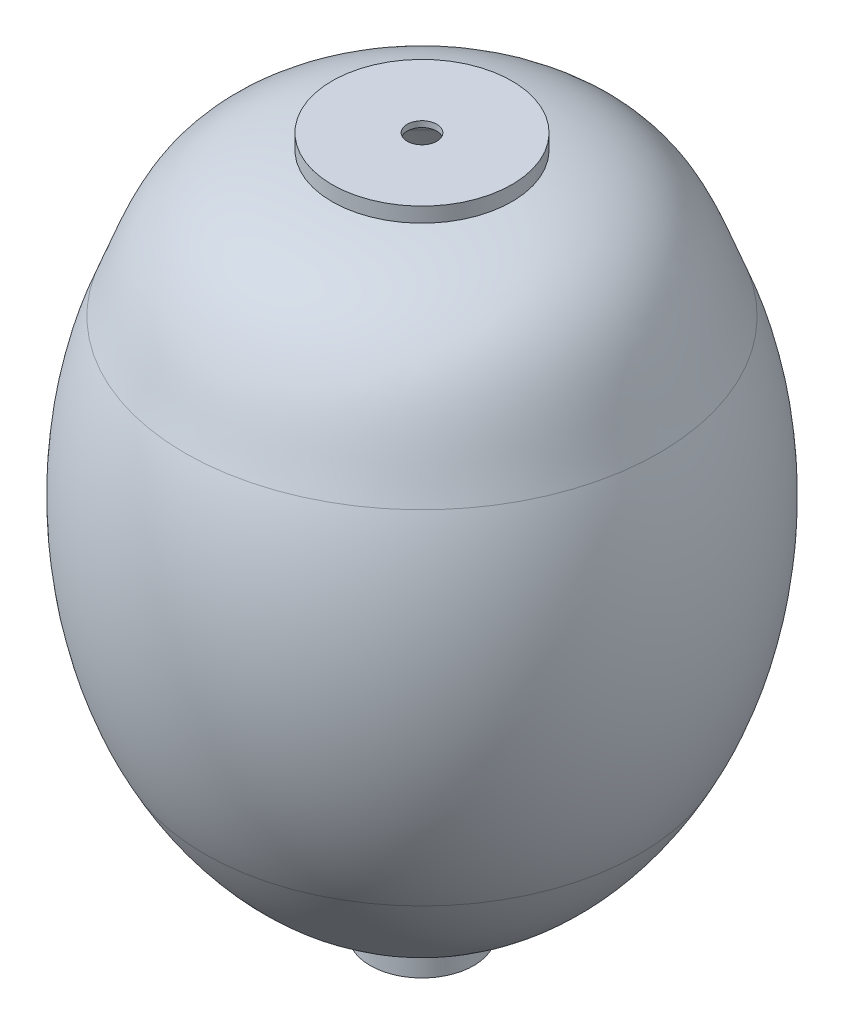
ISO-10303-21;
HEADER;
FILE_DESCRIPTION(('STEP AP214'),'2;1');
FILE_NAME('part.step','',(''),(''),'','','');
FILE_SCHEMA(('AUTOMOTIVE_DESIGN { 1 0 10303 214 1 1 1 1 }'));
ENDSEC;
DATA;
#1=APPLICATION_CONTEXT('core data for automotive mechanical design processes');
#2=APPLICATION_PROTOCOL_DEFINITION('international standard','automotive_design',2000,#1);
#3=PRODUCT_CONTEXT('',#1,'mechanical');
#4=PRODUCT('Part','Part','',(#3));
#5=PRODUCT_RELATED_PRODUCT_CATEGORY('part','',(#4));
#6=PRODUCT_DEFINITION_FORMATION('','',#4);
#7=PRODUCT_DEFINITION_CONTEXT('part definition',#1,'design');
#8=PRODUCT_DEFINITION('design','',#6,#7);
#9=PRODUCT_DEFINITION_SHAPE('','',#8);
#10=(LENGTH_UNIT() NAMED_UNIT(*) SI_UNIT(.MILLI.,.METRE.));
#11=(NAMED_UNIT(*) PLANE_ANGLE_UNIT() SI_UNIT($,.RADIAN.));
#12=(NAMED_UNIT(*) SI_UNIT($,.STERADIAN.) SOLID_ANGLE_UNIT());
#13=UNCERTAINTY_MEASURE_WITH_UNIT(LENGTH_MEASURE(1.E-05),#10,'distance_accuracy_value','');
#14=(GEOMETRIC_REPRESENTATION_CONTEXT(3) GLOBAL_UNCERTAINTY_ASSIGNED_CONTEXT((#13)) GLOBAL_UNIT_ASSIGNED_CONTEXT((#10,
#11,#12)) REPRESENTATION_CONTEXT('',''));
#15=CARTESIAN_POINT('',(0.,0.,0.));
#16=DIRECTION('',(0.,0.,1.));
#17=DIRECTION('',(1.,0.,0.));
#18=AXIS2_PLACEMENT_3D('',#15,#16,#17);
#19=CARTESIAN_POINT('',(17.5,-235.,0.));
#20=DIRECTION('',(0.,-1.,0.));
#21=DIRECTION('',(0.,0.,-1.));
#22=AXIS2_PLACEMENT_3D('',#19,#20,#21);
#23=PLANE('',#22);
#24=CARTESIAN_POINT('',(0.,-235.,0.));
#25=DIRECTION('',(0.,1.,0.));
#26=DIRECTION('',(0.,0.,1.));
#27=AXIS2_PLACEMENT_3D('',#24,#25,#26);
#28=CIRCLE('',#27,17.5);
#29=CARTESIAN_POINT('',(0.,-235.,17.5));
#30=VERTEX_POINT('',#29);
#31=EDGE_CURVE('E51',#30,#30,#28,.T.);
#32=ORIENTED_EDGE('',*,*,#31,.F.);
#33=EDGE_LOOP('',(#32));
#34=FACE_BOUND('',#33,.T.);
#35=CARTESIAN_POINT('',(0.,-235.,0.));
#36=DIRECTION('',(0.,-1.,0.));
#37=DIRECTION('',(0.,0.,-1.));
#38=AXIS2_PLACEMENT_3D('',#35,#36,#37);
#39=CIRCLE('',#38,15.5);
#40=CARTESIAN_POINT('',(0.,-235.,-15.5));
#41=VERTEX_POINT('',#40);
#42=EDGE_CURVE('E119',#41,#41,#39,.F.);
#43=ORIENTED_EDGE('',*,*,#42,.T.);
#44=EDGE_LOOP('',(#43));
#45=FACE_BOUND('',#44,.T.);
#46=ADVANCED_FACE('F34',(#34,#45),#23,.T.);
#47=CARTESIAN_POINT('',(80.0881263458709,-53.7124859830175,0.));
#48=CARTESIAN_POINT('',(80.710342488365,-55.2640261220661,0.));
#49=CARTESIAN_POINT('',(81.2741858341549,-56.7652276019645,0.));
#50=CARTESIAN_POINT('',(82.3147571992674,-59.6970807341503,0.));
#51=CARTESIAN_POINT('',(82.7912292007812,-61.1274778685187,0.));
#52=CARTESIAN_POINT('',(83.674692355385,-63.9359393661717,0.));
#53=CARTESIAN_POINT('',(84.0815676764171,-65.3138872232039,0.));
#54=CARTESIAN_POINT('',(84.8375748860719,-68.0298147518438,0.));
#55=CARTESIAN_POINT('',(85.1866481766047,-69.3677356590304,0.));
#56=CARTESIAN_POINT('',(85.8352476554335,-72.012486421137,0.));
#57=CARTESIAN_POINT('',(86.1347424860591,-73.3192885102625,0.));
#58=CARTESIAN_POINT('',(86.6901060474956,-75.9084552406737,0.));
#59=CARTESIAN_POINT('',(86.9459561890899,-77.190802562418,0.));
#60=CARTESIAN_POINT('',(87.6546491920113,-81.0090032432278,0.));
#61=CARTESIAN_POINT('',(88.0489986398784,-83.516320185153,0.));
#62=CARTESIAN_POINT('',(88.7046668889167,-88.4853647273746,0.));
#63=CARTESIAN_POINT('',(88.965816411287,-90.9469034223611,0.));
#64=CARTESIAN_POINT('',(89.2170440924674,-94.0090450249585,0.));
#65=CARTESIAN_POINT('',(89.2634995429052,-94.6206583822739,0.));
#66=CARTESIAN_POINT('',(89.3488019592586,-95.8396754034184,0.));
#67=CARTESIAN_POINT('',(89.3876812881458,-96.4474581641046,0.));
#68=CARTESIAN_POINT('',(89.4932924169907,-98.266137079561,0.));
#69=CARTESIAN_POINT('',(89.5490080793505,-99.472362876019,0.));
#70=CARTESIAN_POINT('',(89.6739363042001,-103.07595184604,0.));
#71=CARTESIAN_POINT('',(89.70107265688,-105.458305612509,0.));
#72=CARTESIAN_POINT('',(89.6490044848461,-110.199418315352,0.));
#73=CARTESIAN_POINT('',(89.5697759249788,-112.558121163368,0.));
#74=CARTESIAN_POINT('',(89.3065550964941,-117.26639190645,0.));
#75=CARTESIAN_POINT('',(89.1225632531901,-119.615913095809,0.));
#76=CARTESIAN_POINT('',(88.647454667853,-124.31990279348,0.));
#77=CARTESIAN_POINT('',(88.3563626885228,-126.674320786289,0.));
#78=CARTESIAN_POINT('',(87.6603849930431,-131.403215577114,0.));
#79=CARTESIAN_POINT('',(87.2555588470116,-133.777622363459,0.));
#80=CARTESIAN_POINT('',(86.3199257454467,-138.564374285362,0.));
#81=CARTESIAN_POINT('',(85.789242965615,-140.97660114935,0.));
#82=CARTESIAN_POINT('',(85.0344551652448,-144.030180825596,0.));
#83=CARTESIAN_POINT('',(84.8788998290852,-144.64283062346,0.));
#84=CARTESIAN_POINT('',(84.5581549320594,-145.87245418123,0.));
#85=CARTESIAN_POINT('',(84.3928632801931,-146.489797738881,0.));
#86=CARTESIAN_POINT('',(83.8825207521306,-148.346418979336,0.));
#87=CARTESIAN_POINT('',(83.523603773932,-149.588273008897,0.));
#88=CARTESIAN_POINT('',(82.7648188237468,-152.083959929242,0.));
#89=CARTESIAN_POINT('',(82.3649634870394,-153.337782339261,0.));
#90=CARTESIAN_POINT('',(81.5195786768189,-155.861985027802,0.));
#91=CARTESIAN_POINT('',(81.0740693551154,-157.132349205056,0.));
#92=CARTESIAN_POINT('',(80.1310069557352,-159.695439283253,0.));
#93=CARTESIAN_POINT('',(79.6334879825219,-160.988137809007,0.));
#94=CARTESIAN_POINT('',(78.5776047060988,-163.603556835301,0.));
#95=CARTESIAN_POINT('',(78.0193016486283,-164.926228517612,0.));
#96=CARTESIAN_POINT('',(76.8292498056682,-167.612203844525,0.));
#97=CARTESIAN_POINT('',(76.1976208911772,-168.975412370966,0.));
#98=CARTESIAN_POINT('',(74.8902662631054,-171.658896187262,0.));
#99=CARTESIAN_POINT('',(74.2211195265008,-172.975126743526,0.));
#100=CARTESIAN_POINT('',(73.4998627270689,-174.325526667139,0.));
#101=B_SPLINE_CURVE_WITH_KNOTS('',3,(#47,#48,#49,#50,#51,#52,#53,#54,#55,#56,#57,#58,#59,#60,
#61,#62,#63,#64,#65,#66,#67,#68,#69,#70,#71,#72,#73,#74,#75,#76,#77,#78,#79,#80,#81,#82,#83,#84,
#85,#86,#87,#88,#89,#90,#91,#92,#93,#94,#95,#96,#97,#98,#99,#100),.UNSPECIFIED.,.F.,.F.,(4,2,2,
2,2,2,2,2,2,2,2,2,2,2,2,2,2,2,2,2,2,2,2,2,2,2,4),(422.81543537697,427.264785818134,
431.714136259299,436.163486700464,440.612837141628,445.062187582793,449.511538023958,
458.410240575143,467.308941457473,469.533616678055,471.758291898637,476.207642339802,
485.106343222131,494.005044104461,502.903746655646,511.802447537976,520.701148420305,
529.599849302634,531.824524523217,534.049199743799,538.498550184964,542.947902294985,
547.397252736149,551.846603177314,556.295953618479,560.745304059643,564.877541763338),.UNSPECIFIED.);
#102=CARTESIAN_POINT('',(0.,0.,0.));
#103=DIRECTION('',(0.,1.,0.));
#104=AXIS1_PLACEMENT('',#102,#103);
#105=SURFACE_OF_REVOLUTION('',#101,#104);
#106=CARTESIAN_POINT('',(0.,-174.325526667139,0.));
#107=DIRECTION('',(0.,1.,0.));
#108=DIRECTION('',(0.,0.,1.));
#109=AXIS2_PLACEMENT_3D('',#106,#107,#108);
#110=CIRCLE('',#109,73.4998627270689);
#111=CARTESIAN_POINT('',(0.,-174.325526667139,73.4998627270689));
#112=VERTEX_POINT('',#111);
#113=EDGE_CURVE('E57',#112,#112,#110,.T.);
#114=ORIENTED_EDGE('',*,*,#113,.T.);
#115=EDGE_LOOP('',(#114));
#116=FACE_BOUND('',#115,.T.);
#117=CARTESIAN_POINT('',(0.,-53.7124859830175,0.));
#118=DIRECTION('',(0.,1.,0.));
#119=DIRECTION('',(0.,0.,1.));
#120=AXIS2_PLACEMENT_3D('',#117,#118,#119);
#121=CIRCLE('',#120,80.0881263458709);
#122=CARTESIAN_POINT('',(0.,-53.7124859830175,80.0881263458709));
#123=VERTEX_POINT('',#122);
#124=EDGE_CURVE('E10',#123,#123,#121,.T.);
#125=ORIENTED_EDGE('',*,*,#124,.F.);
#126=EDGE_LOOP('',(#125));
#127=FACE_BOUND('',#126,.T.);
#128=ADVANCED_FACE('F88',(#116,#127),#105,.F.);
#129=CARTESIAN_POINT('',(28.7056497375302,-4.7190501530897,0.));
#130=CARTESIAN_POINT('',(29.2615707447891,-4.8127001020598,0.));
#131=CARTESIAN_POINT('',(29.817491752048,-4.9063500510299,0.));
#132=CARTESIAN_POINT('',(30.3734127593069,-5.,0.));
#133=CARTESIAN_POINT('',(68.2556444407139,-11.3816064108277,0.));
#134=CARTESIAN_POINT('',(71.5641609169101,-32.4573728419753,0.));
#135=CARTESIAN_POINT('',(80.0881263458709,-53.7124859830175,0.));
#136=B_SPLINE_CURVE_WITH_KNOTS('',3,(#129,#130,#131,#132,#133,#134,#135),.UNSPECIFIED.,.F.,.F.,
(4,3,4),(-0.0111057726669828,0.,0.756782794098902),.UNSPECIFIED.);
#137=CARTESIAN_POINT('',(0.,0.,0.));
#138=DIRECTION('',(0.,1.,0.));
#139=AXIS1_PLACEMENT('',#137,#138);
#140=SURFACE_OF_REVOLUTION('',#136,#139);
#141=ORIENTED_EDGE('',*,*,#124,.T.);
#142=EDGE_LOOP('',(#141));
#143=FACE_BOUND('',#142,.T.);
#144=CARTESIAN_POINT('',(0.,-5.,0.));
#145=DIRECTION('',(0.,1.,0.));
#146=DIRECTION('',(0.,0.,1.));
#147=AXIS2_PLACEMENT_3D('',#144,#145,#146);
#148=CIRCLE('',#147,30.3734127593069);
#149=CARTESIAN_POINT('',(0.,-5.,30.3734127593069));
#150=VERTEX_POINT('',#149);
#151=EDGE_CURVE('E42',#150,#150,#148,.T.);
#152=ORIENTED_EDGE('',*,*,#151,.F.);
#153=EDGE_LOOP('',(#152));
#154=FACE_BOUND('',#153,.T.);
#155=ADVANCED_FACE('F95',(#143,#154),#140,.F.);
#156=CARTESIAN_POINT('',(0.,0.,0.));
#157=DIRECTION('',(0.,1.,0.));
#158=DIRECTION('',(0.,0.,1.));
#159=AXIS2_PLACEMENT_3D('',#156,#157,#158);
#160=CYLINDRICAL_SURFACE('',#159,30.3734127593069);
#161=ORIENTED_EDGE('',*,*,#151,.T.);
#162=EDGE_LOOP('',(#161));
#163=FACE_BOUND('',#162,.T.);
#164=CARTESIAN_POINT('',(0.,0.,0.));
#165=DIRECTION('',(0.,1.,0.));
#166=DIRECTION('',(0.,0.,1.));
#167=AXIS2_PLACEMENT_3D('',#164,#165,#166);
#168=CIRCLE('',#167,30.3734127593069);
#169=CARTESIAN_POINT('',(0.,0.,30.3734127593069));
#170=VERTEX_POINT('',#169);
#171=EDGE_CURVE('E46',#170,#170,#168,.T.);
#172=ORIENTED_EDGE('',*,*,#171,.F.);
#173=EDGE_LOOP('',(#172));
#174=FACE_BOUND('',#173,.T.);
#175=ADVANCED_FACE('F36',(#163,#174),#160,.T.);
#176=CARTESIAN_POINT('',(0.,0.,0.));
#177=DIRECTION('',(0.,1.,0.));
#178=DIRECTION('',(0.,0.,1.));
#179=AXIS2_PLACEMENT_3D('',#176,#177,#178);
#180=PLANE('',#179);
#181=CARTESIAN_POINT('',(0.,0.,0.));
#182=DIRECTION('',(0.,1.,0.));
#183=DIRECTION('',(0.,0.,1.));
#184=AXIS2_PLACEMENT_3D('',#181,#182,#183);
#185=CIRCLE('',#184,5.);
#186=CARTESIAN_POINT('',(0.,0.,5.));
#187=VERTEX_POINT('',#186);
#188=EDGE_CURVE('E100',#187,#187,#185,.T.);
#189=ORIENTED_EDGE('',*,*,#188,.F.);
#190=EDGE_LOOP('',(#189));
#191=FACE_BOUND('',#190,.T.);
#192=ORIENTED_EDGE('',*,*,#171,.T.);
#193=EDGE_LOOP('',(#192));
#194=FACE_BOUND('',#193,.T.);
#195=ADVANCED_FACE('F85',(#191,#194),#180,.T.);
#196=CARTESIAN_POINT('',(0.,0.,0.));
#197=DIRECTION('',(0.,1.,0.));
#198=DIRECTION('',(0.,0.,1.));
#199=AXIS2_PLACEMENT_3D('',#196,#197,#198);
#200=CYLINDRICAL_SURFACE('',#199,17.5);
#201=ORIENTED_EDGE('',*,*,#31,.T.);
#202=EDGE_LOOP('',(#201));
#203=FACE_BOUND('',#202,.T.);
#204=CARTESIAN_POINT('',(0.,-223.,0.));
#205=DIRECTION('',(0.,1.,0.));
#206=DIRECTION('',(0.,0.,1.));
#207=AXIS2_PLACEMENT_3D('',#204,#205,#206);
#208=CIRCLE('',#207,17.5);
#209=CARTESIAN_POINT('',(0.,-223.,17.5));
#210=VERTEX_POINT('',#209);
#211=EDGE_CURVE('E54',#210,#210,#208,.T.);
#212=ORIENTED_EDGE('',*,*,#211,.F.);
#213=EDGE_LOOP('',(#212));
#214=FACE_BOUND('',#213,.T.);
#215=ADVANCED_FACE('F79',(#203,#214),#200,.T.);
#216=CARTESIAN_POINT('',(73.4998627270689,-174.325526667139,0.));
#217=CARTESIAN_POINT('',(70.7099181398484,-179.549104400387,0.));
#218=CARTESIAN_POINT('',(67.616272146013,-184.537335561845,0.));
#219=CARTESIAN_POINT('',(62.4700128014443,-191.627731449582,0.));
#220=CARTESIAN_POINT('',(60.6697935325632,-193.925483290738,0.));
#221=CARTESIAN_POINT('',(56.8828993218647,-198.376497344551,0.));
#222=CARTESIAN_POINT('',(54.8963555172367,-200.529861179022,0.));
#223=CARTESIAN_POINT('',(51.7574056593352,-203.636589500954,0.));
#224=CARTESIAN_POINT('',(50.6844849427149,-204.651549361637,0.));
#225=CARTESIAN_POINT('',(49.0318114012319,-206.140440629786,0.));
#226=CARTESIAN_POINT('',(48.472875981197,-206.63183277172,0.));
#227=CARTESIAN_POINT('',(47.34472122489,-207.598804202862,0.));
#228=CARTESIAN_POINT('',(46.7755749900425,-208.074365155283,0.));
#229=CARTESIAN_POINT('',(43.9039349350961,-210.411663397778,0.));
#230=CARTESIAN_POINT('',(41.5238766637501,-212.15213470183,0.));
#231=CARTESIAN_POINT('',(36.5798705795677,-215.345580316029,0.));
#232=CARTESIAN_POINT('',(34.0165049593307,-216.799464839018,0.));
#233=CARTESIAN_POINT('',(30.6842640428544,-218.416649463265,0.));
#234=CARTESIAN_POINT('',(30.0113860703097,-218.730033912777,0.));
#235=CARTESIAN_POINT('',(28.6522992798772,-219.335961072072,0.));
#236=CARTESIAN_POINT('',(27.9656623270821,-219.628617073871,0.));
#237=CARTESIAN_POINT('',(24.0773622293032,-221.20923203769,0.));
#238=CARTESIAN_POINT('',(20.8188153414694,-222.242844297427,0.));
#239=CARTESIAN_POINT('',(17.5,-223.,0.));
#240=CARTESIAN_POINT('',(16.9816169151001,-223.118264099827,0.));
#241=CARTESIAN_POINT('',(16.4632338302002,-223.236528199653,0.));
#242=CARTESIAN_POINT('',(15.9448507453003,-223.35479229948,0.));
#243=B_SPLINE_CURVE_WITH_KNOTS('',3,(#216,#217,#218,#219,#220,#221,#222,#223,#224,#225,#226,
#227,#228,#229,#230,#231,#232,#233,#234,#235,#236,#237,#238,#239,#240,#241,#242),.UNSPECIFIED.,
.F.,.F.,(4,2,2,2,2,2,2,2,2,2,2,3,4),(-1.26186877394701E-12,0.249999999999999,0.374999999999999,
0.499999999999999,0.562499999999998,0.593749999999998,0.624999999999998,0.749999999999998,
0.874999999999999,0.906249999999999,0.937499999999999,1.08285506689052,1.10555883321311),.UNSPECIFIED.);
#244=CARTESIAN_POINT('',(0.,0.,0.));
#245=DIRECTION('',(0.,1.,0.));
#246=AXIS1_PLACEMENT('',#244,#245);
#247=SURFACE_OF_REVOLUTION('',#243,#246);
#248=ORIENTED_EDGE('',*,*,#211,.T.);
#249=EDGE_LOOP('',(#248));
#250=FACE_BOUND('',#249,.T.);
#251=ORIENTED_EDGE('',*,*,#113,.F.);
#252=EDGE_LOOP('',(#251));
#253=FACE_BOUND('',#252,.T.);
#254=ADVANCED_FACE('F73',(#250,#253),#247,.F.);
#255=CARTESIAN_POINT('',(80.0881263458709,-53.7124859830175,0.));
#256=CARTESIAN_POINT('',(80.710342488365,-55.2640261220661,0.));
#257=CARTESIAN_POINT('',(81.2741858341549,-56.7652276019645,0.));
#258=CARTESIAN_POINT('',(82.3147571992674,-59.6970807341503,0.));
#259=CARTESIAN_POINT('',(82.7912292007812,-61.1274778685187,0.));
#260=CARTESIAN_POINT('',(83.674692355385,-63.9359393661717,0.));
#261=CARTESIAN_POINT('',(84.0815676764171,-65.3138872232039,0.));
#262=CARTESIAN_POINT('',(84.8375748860719,-68.0298147518438,0.));
#263=CARTESIAN_POINT('',(85.1866481766047,-69.3677356590304,0.));
#264=CARTESIAN_POINT('',(85.8352476554335,-72.012486421137,0.));
#265=CARTESIAN_POINT('',(86.1347424860591,-73.3192885102625,0.));
#266=CARTESIAN_POINT('',(86.6901060474956,-75.9084552406737,0.));
#267=CARTESIAN_POINT('',(86.9459561890899,-77.190802562418,0.));
#268=CARTESIAN_POINT('',(87.6546491920113,-81.0090032432278,0.));
#269=CARTESIAN_POINT('',(88.0489986398784,-83.516320185153,0.));
#270=CARTESIAN_POINT('',(88.7046668889167,-88.4853647273746,0.));
#271=CARTESIAN_POINT('',(88.965816411287,-90.9469034223611,0.));
#272=CARTESIAN_POINT('',(89.2170440924674,-94.0090450249585,0.));
#273=CARTESIAN_POINT('',(89.2634995429052,-94.6206583822739,0.));
#274=CARTESIAN_POINT('',(89.3488019592586,-95.8396754034184,0.));
#275=CARTESIAN_POINT('',(89.3876812881458,-96.4474581641046,0.));
#276=CARTESIAN_POINT('',(89.4932924169907,-98.266137079561,0.));
#277=CARTESIAN_POINT('',(89.5490080793505,-99.472362876019,0.));
#278=CARTESIAN_POINT('',(89.6739363042001,-103.07595184604,0.));
#279=CARTESIAN_POINT('',(89.70107265688,-105.458305612509,0.));
#280=CARTESIAN_POINT('',(89.6490044848461,-110.199418315352,0.));
#281=CARTESIAN_POINT('',(89.5697759249788,-112.558121163368,0.));
#282=CARTESIAN_POINT('',(89.3065550964941,-117.26639190645,0.));
#283=CARTESIAN_POINT('',(89.1225632531901,-119.615913095809,0.));
#284=CARTESIAN_POINT('',(88.647454667853,-124.31990279348,0.));
#285=CARTESIAN_POINT('',(88.3563626885228,-126.674320786289,0.));
#286=CARTESIAN_POINT('',(87.6603849930431,-131.403215577114,0.));
#287=CARTESIAN_POINT('',(87.2555588470116,-133.777622363459,0.));
#288=CARTESIAN_POINT('',(86.3199257454467,-138.564374285362,0.));
#289=CARTESIAN_POINT('',(85.789242965615,-140.97660114935,0.));
#290=CARTESIAN_POINT('',(85.0344551652448,-144.030180825596,0.));
#291=CARTESIAN_POINT('',(84.8788998290852,-144.64283062346,0.));
#292=CARTESIAN_POINT('',(84.5581549320594,-145.87245418123,0.));
#293=CARTESIAN_POINT('',(84.3928632801931,-146.489797738881,0.));
#294=CARTESIAN_POINT('',(83.8825207521306,-148.346418979336,0.));
#295=CARTESIAN_POINT('',(83.523603773932,-149.588273008897,0.));
#296=CARTESIAN_POINT('',(82.7648188237468,-152.083959929242,0.));
#297=CARTESIAN_POINT('',(82.3649634870394,-153.337782339261,0.));
#298=CARTESIAN_POINT('',(81.5195786768189,-155.861985027802,0.));
#299=CARTESIAN_POINT('',(81.0740693551154,-157.132349205056,0.));
#300=CARTESIAN_POINT('',(80.1310069557352,-159.695439283253,0.));
#301=CARTESIAN_POINT('',(79.6334879825219,-160.988137809007,0.));
#302=CARTESIAN_POINT('',(78.5776047060988,-163.603556835301,0.));
#303=CARTESIAN_POINT('',(78.0193016486283,-164.926228517612,0.));
#304=CARTESIAN_POINT('',(76.8292498056682,-167.612203844525,0.));
#305=CARTESIAN_POINT('',(76.1976208911772,-168.975412370966,0.));
#306=CARTESIAN_POINT('',(74.8902662631054,-171.658896187262,0.));
#307=CARTESIAN_POINT('',(74.2211195265008,-172.975126743526,0.));
#308=CARTESIAN_POINT('',(73.4998627270689,-174.325526667139,0.));
#309=B_SPLINE_CURVE_WITH_KNOTS('',3,(#255,#256,#257,#258,#259,#260,#261,#262,#263,#264,#265,
#266,#267,#268,#269,#270,#271,#272,#273,#274,#275,#276,#277,#278,#279,#280,#281,#282,#283,#284,
#285,#286,#287,#288,#289,#290,#291,#292,#293,#294,#295,#296,#297,#298,#299,#300,#301,#302,#303,
#304,#305,#306,#307,#308),.UNSPECIFIED.,.F.,.F.,(4,2,2,2,2,2,2,2,2,2,2,2,2,2,2,2,2,2,2,2,2,2,2,
2,2,2,4),(422.81543537697,427.264785818134,431.714136259299,436.163486700464,440.612837141628,
445.062187582793,449.511538023958,458.410240575143,467.308941457473,469.533616678055,
471.758291898637,476.207642339802,485.106343222131,494.005044104461,502.903746655646,
511.802447537976,520.701148420305,529.599849302634,531.824524523217,534.049199743799,
538.498550184964,542.947902294985,547.397252736149,551.846603177314,556.295953618479,
560.745304059643,564.877541763338),.UNSPECIFIED.);
#310=CARTESIAN_POINT('',(0.,0.,0.));
#311=DIRECTION('',(0.,1.,0.));
#312=AXIS1_PLACEMENT('',#310,#311);
#313=SURFACE_OF_REVOLUTION('',#309,#312);
#314=OFFSET_SURFACE('',#313,2.,.F.);
#315=CARTESIAN_POINT('',(0.,-173.383289036622,0.));
#316=DIRECTION('',(0.,1.,0.));
#317=DIRECTION('',(1.,0.,0.));
#318=AXIS2_PLACEMENT_3D('',#315,#316,#317);
#319=CIRCLE('',#318,71.7357232066123);
#320=CARTESIAN_POINT('',(71.7357232066123,-173.383289036622,0.));
#321=VERTEX_POINT('',#320);
#322=EDGE_CURVE('E106',#321,#321,#319,.T.);
#323=ORIENTED_EDGE('',*,*,#322,.F.);
#324=EDGE_LOOP('',(#323));
#325=FACE_BOUND('',#324,.T.);
#326=CARTESIAN_POINT('',(0.,-54.4569173654654,0.));
#327=DIRECTION('',(0.,1.,0.));
#328=DIRECTION('',(1.,0.,0.));
#329=AXIS2_PLACEMENT_3D('',#326,#327,#328);
#330=CIRCLE('',#329,78.2318338266739);
#331=CARTESIAN_POINT('',(78.2318338266739,-54.4569173654654,0.));
#332=VERTEX_POINT('',#331);
#333=EDGE_CURVE('E60',#332,#332,#330,.T.);
#334=ORIENTED_EDGE('',*,*,#333,.T.);
#335=EDGE_LOOP('',(#334));
#336=FACE_BOUND('',#335,.T.);
#337=ADVANCED_FACE('F78',(#325,#336),#314,.T.);
#338=CARTESIAN_POINT('',(28.7056497375302,-4.7190501530897,0.));
#339=CARTESIAN_POINT('',(29.2615707447891,-4.8127001020598,0.));
#340=CARTESIAN_POINT('',(29.817491752048,-4.9063500510299,0.));
#341=CARTESIAN_POINT('',(68.2556444407139,-11.3816064108277,0.));
#342=CARTESIAN_POINT('',(71.5641609169101,-32.4573728419753,0.));
#343=CARTESIAN_POINT('',(80.0881263458709,-53.7124859830175,0.));
#344=B_SPLINE_CURVE_WITH_KNOTS('',3,(#338,#339,#340,#341,#342,#343),.UNSPECIFIED.,.F.,.F.,(4,2,
4),(-0.0111057726669828,0.,0.756782794098902),.UNSPECIFIED.);
#345=CARTESIAN_POINT('',(0.,0.,0.));
#346=DIRECTION('',(0.,1.,0.));
#347=AXIS1_PLACEMENT('',#345,#346);
#348=SURFACE_OF_REVOLUTION('',#344,#347);
#349=OFFSET_SURFACE('',#348,2.,.F.);
#350=ORIENTED_EDGE('',*,*,#333,.F.);
#351=EDGE_LOOP('',(#350));
#352=FACE_BOUND('',#351,.T.);
#353=CARTESIAN_POINT('',(0.,-6.69126175185416,0.));
#354=DIRECTION('',(0.,1.,0.));
#355=DIRECTION('',(0.,0.,1.));
#356=AXIS2_PLACEMENT_3D('',#353,#354,#355);
#357=CIRCLE('',#356,28.3734127593069);
#358=CARTESIAN_POINT('',(0.,-6.69126175185416,28.3734127593069));
#359=VERTEX_POINT('',#358);
#360=EDGE_CURVE('E113',#359,#359,#357,.T.);
#361=ORIENTED_EDGE('',*,*,#360,.T.);
#362=EDGE_LOOP('',(#361));
#363=FACE_BOUND('',#362,.T.);
#364=ADVANCED_FACE('F136',(#352,#363),#349,.T.);
#365=CARTESIAN_POINT('',(0.,0.,0.));
#366=DIRECTION('',(0.,1.,0.));
#367=DIRECTION('',(0.,0.,1.));
#368=AXIS2_PLACEMENT_3D('',#365,#366,#367);
#369=CYLINDRICAL_SURFACE('',#368,28.3734127593069);
#370=ORIENTED_EDGE('',*,*,#360,.F.);
#371=EDGE_LOOP('',(#370));
#372=FACE_BOUND('',#371,.T.);
#373=CARTESIAN_POINT('',(0.,-2.,0.));
#374=DIRECTION('',(0.,1.,0.));
#375=DIRECTION('',(0.,0.,1.));
#376=AXIS2_PLACEMENT_3D('',#373,#374,#375);
#377=CIRCLE('',#376,28.3734127593069);
#378=CARTESIAN_POINT('',(0.,-2.,28.3734127593069));
#379=VERTEX_POINT('',#378);
#380=EDGE_CURVE('E116',#379,#379,#377,.T.);
#381=ORIENTED_EDGE('',*,*,#380,.T.);
#382=EDGE_LOOP('',(#381));
#383=FACE_BOUND('',#382,.T.);
#384=ADVANCED_FACE('F139',(#372,#383),#369,.F.);
#385=CARTESIAN_POINT('',(0.,-2.,0.));
#386=DIRECTION('',(0.,1.,0.));
#387=DIRECTION('',(0.,0.,1.));
#388=AXIS2_PLACEMENT_3D('',#385,#386,#387);
#389=PLANE('',#388);
#390=CARTESIAN_POINT('',(0.,-2.,0.));
#391=DIRECTION('',(0.,1.,0.));
#392=DIRECTION('',(0.,0.,1.));
#393=AXIS2_PLACEMENT_3D('',#390,#391,#392);
#394=CIRCLE('',#393,5.);
#395=CARTESIAN_POINT('',(0.,-2.,5.));
#396=VERTEX_POINT('',#395);
#397=EDGE_CURVE('E38',#396,#396,#394,.T.);
#398=ORIENTED_EDGE('',*,*,#397,.T.);
#399=EDGE_LOOP('',(#398));
#400=FACE_BOUND('',#399,.T.);
#401=ORIENTED_EDGE('',*,*,#380,.F.);
#402=EDGE_LOOP('',(#401));
#403=FACE_BOUND('',#402,.T.);
#404=ADVANCED_FACE('F146',(#400,#403),#389,.F.);
#405=CARTESIAN_POINT('',(0.,0.,0.));
#406=DIRECTION('',(0.,1.,0.));
#407=DIRECTION('',(0.,0.,1.));
#408=AXIS2_PLACEMENT_3D('',#405,#406,#407);
#409=CYLINDRICAL_SURFACE('',#408,15.5);
#410=ORIENTED_EDGE('',*,*,#42,.F.);
#411=EDGE_LOOP('',(#410));
#412=FACE_BOUND('',#411,.T.);
#413=CARTESIAN_POINT('',(0.,-221.404892862481,0.));
#414=DIRECTION('',(0.,1.,0.));
#415=DIRECTION('',(0.,0.,1.));
#416=AXIS2_PLACEMENT_3D('',#413,#414,#415);
#417=CIRCLE('',#416,15.5);
#418=CARTESIAN_POINT('',(0.,-221.404892862481,15.5));
#419=VERTEX_POINT('',#418);
#420=EDGE_CURVE('E110',#419,#419,#417,.T.);
#421=ORIENTED_EDGE('',*,*,#420,.T.);
#422=EDGE_LOOP('',(#421));
#423=FACE_BOUND('',#422,.T.);
#424=ADVANCED_FACE('F149',(#412,#423),#409,.F.);
#425=CARTESIAN_POINT('',(73.4998627270689,-174.325526667139,0.));
#426=CARTESIAN_POINT('',(70.7099181398484,-179.549104400387,0.));
#427=CARTESIAN_POINT('',(67.616272146013,-184.537335561845,0.));
#428=CARTESIAN_POINT('',(62.4700128014443,-191.627731449582,0.));
#429=CARTESIAN_POINT('',(60.6697935325632,-193.925483290738,0.));
#430=CARTESIAN_POINT('',(56.8828993218647,-198.376497344551,0.));
#431=CARTESIAN_POINT('',(54.8963555172367,-200.529861179022,0.));
#432=CARTESIAN_POINT('',(51.7574056593352,-203.636589500954,0.));
#433=CARTESIAN_POINT('',(50.6844849427149,-204.651549361637,0.));
#434=CARTESIAN_POINT('',(49.0318114012319,-206.140440629786,0.));
#435=CARTESIAN_POINT('',(48.472875981197,-206.63183277172,0.));
#436=CARTESIAN_POINT('',(47.34472122489,-207.598804202862,0.));
#437=CARTESIAN_POINT('',(46.7755749900425,-208.074365155283,0.));
#438=CARTESIAN_POINT('',(43.9039349350961,-210.411663397778,0.));
#439=CARTESIAN_POINT('',(41.5238766637501,-212.15213470183,0.));
#440=CARTESIAN_POINT('',(36.5798705795677,-215.345580316029,0.));
#441=CARTESIAN_POINT('',(34.0165049593307,-216.799464839018,0.));
#442=CARTESIAN_POINT('',(30.6842640428544,-218.416649463265,0.));
#443=CARTESIAN_POINT('',(30.0113860703097,-218.730033912777,0.));
#444=CARTESIAN_POINT('',(28.6522992798772,-219.335961072072,0.));
#445=CARTESIAN_POINT('',(27.9656623270821,-219.628617073871,0.));
#446=CARTESIAN_POINT('',(24.0773622293032,-221.20923203769,0.));
#447=CARTESIAN_POINT('',(20.8188153414694,-222.242844297427,0.));
#448=CARTESIAN_POINT('',(16.9816169151001,-223.118264099827,0.));
#449=CARTESIAN_POINT('',(16.4632338302002,-223.236528199653,0.));
#450=CARTESIAN_POINT('',(15.9448507453003,-223.35479229948,0.));
#451=B_SPLINE_CURVE_WITH_KNOTS('',3,(#425,#426,#427,#428,#429,#430,#431,#432,#433,#434,#435,
#436,#437,#438,#439,#440,#441,#442,#443,#444,#445,#446,#447,#448,#449,#450),.UNSPECIFIED.,.F.,
.F.,(4,2,2,2,2,2,2,2,2,2,2,2,4),(-1.26186877394701E-12,0.249999999999999,0.374999999999999,
0.499999999999999,0.562499999999998,0.593749999999998,0.624999999999998,0.749999999999998,
0.874999999999999,0.906249999999999,0.937499999999999,1.08285506689052,1.10555883321311),.UNSPECIFIED.);
#452=CARTESIAN_POINT('',(0.,0.,0.));
#453=DIRECTION('',(0.,1.,0.));
#454=AXIS1_PLACEMENT('',#452,#453);
#455=SURFACE_OF_REVOLUTION('',#451,#454);
#456=OFFSET_SURFACE('',#455,2.,.F.);
#457=ORIENTED_EDGE('',*,*,#420,.F.);
#458=EDGE_LOOP('',(#457));
#459=FACE_BOUND('',#458,.T.);
#460=ORIENTED_EDGE('',*,*,#322,.T.);
#461=EDGE_LOOP('',(#460));
#462=FACE_BOUND('',#461,.T.);
#463=ADVANCED_FACE('F81',(#459,#462),#456,.T.);
#464=CARTESIAN_POINT('',(0.,-15.,0.));
#465=DIRECTION('',(0.,1.,0.));
#466=DIRECTION('',(0.,0.,1.));
#467=AXIS2_PLACEMENT_3D('',#464,#465,#466);
#468=CYLINDRICAL_SURFACE('',#467,5.);
#469=ORIENTED_EDGE('',*,*,#188,.T.);
#470=EDGE_LOOP('',(#469));
#471=FACE_BOUND('',#470,.T.);
#472=ORIENTED_EDGE('',*,*,#397,.F.);
#473=EDGE_LOOP('',(#472));
#474=FACE_BOUND('',#473,.T.);
#475=ADVANCED_FACE('F156',(#471,#474),#468,.F.);
#476=CLOSED_SHELL('',(#46,#128,#155,#175,#195,#215,#254,#337,#364,#384,#404,#424,#463,#475));
#477=MANIFOLD_SOLID_BREP('B2',#476);
#478=ADVANCED_BREP_SHAPE_REPRESENTATION('',(#18,#477),#14);
#479=SHAPE_DEFINITION_REPRESENTATION(#9,#478);
ENDSEC;
END-ISO-10303-21;
